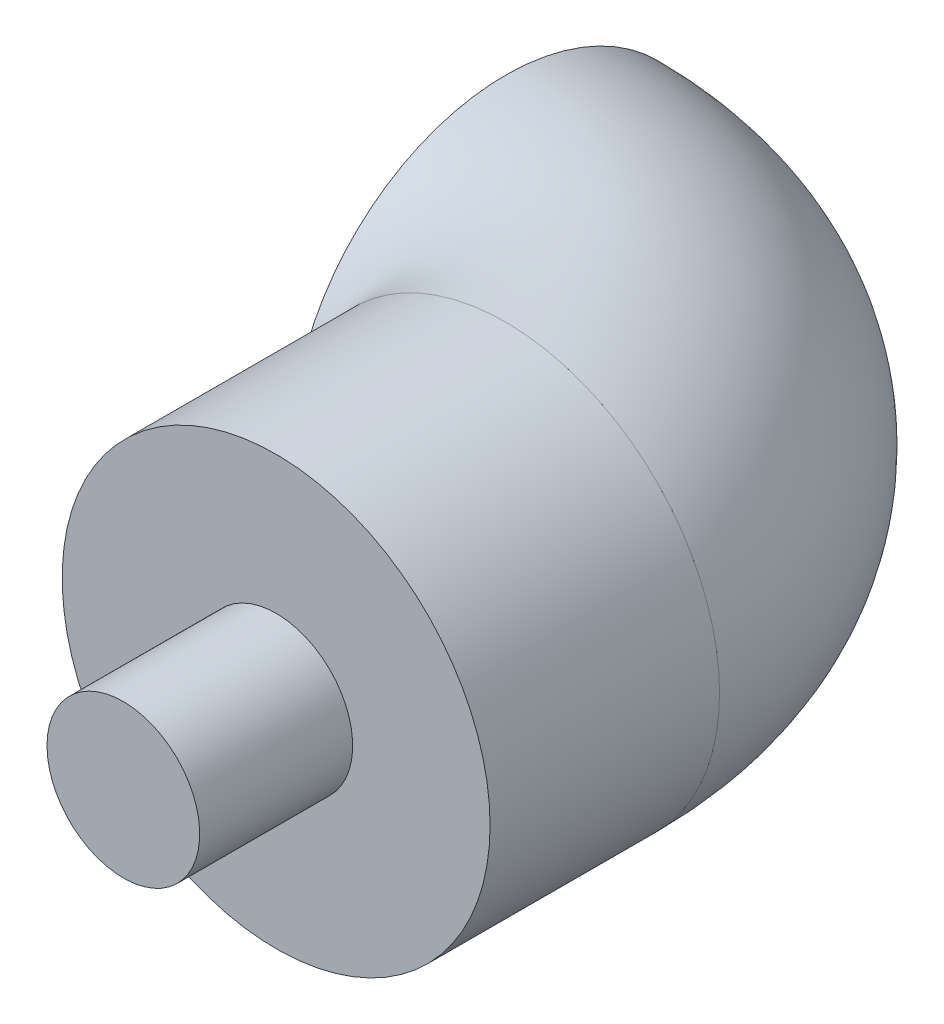
ISO-10303-21;
HEADER;
FILE_DESCRIPTION(('STEP AP214'),'2;1');
FILE_NAME('part.step','',(''),(''),'','','');
FILE_SCHEMA(('AUTOMOTIVE_DESIGN { 1 0 10303 214 1 1 1 1 }'));
ENDSEC;
DATA;
#1=APPLICATION_CONTEXT('core data for automotive mechanical design processes');
#2=APPLICATION_PROTOCOL_DEFINITION('international standard','automotive_design',2000,#1);
#3=PRODUCT_CONTEXT('',#1,'mechanical');
#4=PRODUCT('Part','Part','',(#3));
#5=PRODUCT_RELATED_PRODUCT_CATEGORY('part','',(#4));
#6=PRODUCT_DEFINITION_FORMATION('','',#4);
#7=PRODUCT_DEFINITION_CONTEXT('part definition',#1,'design');
#8=PRODUCT_DEFINITION('design','',#6,#7);
#9=PRODUCT_DEFINITION_SHAPE('','',#8);
#10=(LENGTH_UNIT() NAMED_UNIT(*) SI_UNIT(.MILLI.,.METRE.));
#11=(NAMED_UNIT(*) PLANE_ANGLE_UNIT() SI_UNIT($,.RADIAN.));
#12=(NAMED_UNIT(*) SI_UNIT($,.STERADIAN.) SOLID_ANGLE_UNIT());
#13=UNCERTAINTY_MEASURE_WITH_UNIT(LENGTH_MEASURE(1.E-05),#10,'distance_accuracy_value','');
#14=(GEOMETRIC_REPRESENTATION_CONTEXT(3) GLOBAL_UNCERTAINTY_ASSIGNED_CONTEXT((#13)) GLOBAL_UNIT_ASSIGNED_CONTEXT((#10,
#11,#12)) REPRESENTATION_CONTEXT('',''));
#15=CARTESIAN_POINT('',(0.,0.,0.));
#16=DIRECTION('',(0.,0.,1.));
#17=DIRECTION('',(1.,0.,0.));
#18=AXIS2_PLACEMENT_3D('',#15,#16,#17);
#19=CARTESIAN_POINT('',(0.,0.,0.));
#20=DIRECTION('',(1.,0.,0.));
#21=DIRECTION('',(0.,0.,-1.));
#22=AXIS2_PLACEMENT_3D('',#19,#20,#21);
#23=PLANE('',#22);
#24=CARTESIAN_POINT('',(0.,0.,0.));
#25=DIRECTION('',(-1.,0.,0.));
#26=DIRECTION('',(0.,0.,1.));
#27=AXIS2_PLACEMENT_3D('',#24,#25,#26);
#28=CIRCLE('',#27,25.);
#29=CARTESIAN_POINT('',(0.,0.,25.));
#30=VERTEX_POINT('',#29);
#31=EDGE_CURVE('E151',#30,#30,#28,.T.);
#32=ORIENTED_EDGE('',*,*,#31,.F.);
#33=EDGE_LOOP('',(#32));
#34=FACE_BOUND('',#33,.T.);
#35=CARTESIAN_POINT('',(0.,0.,75291.7747451518));
#36=DIRECTION('',(1.,0.,0.));
#37=DIRECTION('',(0.,0.,-1.));
#38=AXIS2_PLACEMENT_3D('',#35,#36,#37);
#39=ELLIPSE('',#38,75273.1913815593,70.0565010235184);
#40=CARTESIAN_POINT('',(0.,-2.58729203974121,69.9347905498961));
#41=VERTEX_POINT('',#40);
#42=CARTESIAN_POINT('',(0.,-2.58772923929178,69.9521526286655));
#43=VERTEX_POINT('',#42);
#44=EDGE_CURVE('E55',#41,#43,#39,.F.);
#45=ORIENTED_EDGE('',*,*,#44,.F.);
#46=DIRECTION('',(0.,-1.,0.));
#47=VECTOR('',#46,1.);
#48=CARTESIAN_POINT('',(0.,0.,69.9347905498961));
#49=LINE('',#48,#47);
#50=CARTESIAN_POINT('',(0.,2.58729203974121,69.9347905498961));
#51=VERTEX_POINT('',#50);
#52=EDGE_CURVE('E59',#51,#41,#49,.T.);
#53=ORIENTED_EDGE('',*,*,#52,.F.);
#54=CARTESIAN_POINT('',(0.,2.58772923929137,69.9521526286655));
#55=VERTEX_POINT('',#54);
#56=EDGE_CURVE('E154',#55,#51,#39,.F.);
#57=ORIENTED_EDGE('',*,*,#56,.F.);
#58=CARTESIAN_POINT('',(0.,0.,0.));
#59=DIRECTION('',(1.,0.,0.));
#60=DIRECTION('',(0.,0.,-1.));
#61=AXIS2_PLACEMENT_3D('',#58,#59,#60);
#62=CIRCLE('',#61,70.);
#63=EDGE_CURVE('E88',#43,#55,#62,.T.);
#64=ORIENTED_EDGE('',*,*,#63,.F.);
#65=EDGE_LOOP('',(#45,#53,#57,#64));
#66=FACE_BOUND('',#65,.T.);
#67=ADVANCED_FACE('F35',(#34,#66),#23,.F.);
#68=CARTESIAN_POINT('',(140.065148788121,0.,70.0651487598923));
#69=CARTESIAN_POINT('',(140.103340216377,0.,-12.0054841209013));
#70=CARTESIAN_POINT('',(82.0706328807858,0.,-70.0381914447962));
#71=CARTESIAN_POINT('',(0.,0.,-70.));
#72=CARTESIAN_POINT('',(140.065148788121,140.,70.0651487598923));
#73=CARTESIAN_POINT('',(140.103340216377,140.,-12.0054841209013));
#74=CARTESIAN_POINT('',(82.0706328807858,140.,-70.0381914447962));
#75=CARTESIAN_POINT('',(0.,140.,-70.));
#76=CARTESIAN_POINT('',(0.0652094218618407,140.,69.9348512401076));
#77=CARTESIAN_POINT('',(0.0270179936063658,140.,69.9348156954609));
#78=CARTESIAN_POINT('',(0.,140.,69.9618085552039));
#79=CARTESIAN_POINT('',(0.,140.,70.));
#80=CARTESIAN_POINT('',(0.0652094218618338,0.,69.9348512401076));
#81=CARTESIAN_POINT('',(0.0270179936063589,0.,69.934815695461));
#82=CARTESIAN_POINT('',(0.,0.,69.9618085552039));
#83=CARTESIAN_POINT('',(0.,0.,70.));
#84=CARTESIAN_POINT('',(0.0652094218618199,-140.,69.9348512401076));
#85=CARTESIAN_POINT('',(0.027017993606345,-140.,69.934815695461));
#86=CARTESIAN_POINT('',(0.,-140.,69.9618085552039));
#87=CARTESIAN_POINT('',(0.,-140.,70.));
#88=CARTESIAN_POINT('',(140.065148788121,-140.,70.0651487598923));
#89=CARTESIAN_POINT('',(140.103340216377,-140.,-12.0054841209013));
#90=CARTESIAN_POINT('',(82.0706328807858,-140.,-70.0381914447962));
#91=CARTESIAN_POINT('',(0.,-140.,-70.));
#92=CARTESIAN_POINT('',(140.065148788121,0.,70.0651487598923));
#93=CARTESIAN_POINT('',(140.103340216377,0.,-12.0054841209013));
#94=CARTESIAN_POINT('',(82.0706328807858,0.,-70.0381914447962));
#95=CARTESIAN_POINT('',(0.,0.,-70.));
#96=(BOUNDED_SURFACE() B_SPLINE_SURFACE(3,3,((#68,#69,#70,#71),(#72,#73,#74,#75),(#76,#77,#78,
#79),(#80,#81,#82,#83),(#84,#85,#86,#87),(#88,#89,#90,#91),(#92,#93,#94,#95)),.UNSPECIFIED.,.T.,
.F.,.F.) B_SPLINE_SURFACE_WITH_KNOTS((4,3,4),(4,4),(0.,0.5,1.),(0.,1.),
.UNSPECIFIED.) GEOMETRIC_REPRESENTATION_ITEM() RATIONAL_B_SPLINE_SURFACE(((1.,0.804518435774239,
0.804518435774239,1.),(0.333333333333333,0.268172811924746,0.268172811924746,0.333333333333333),
(0.333333333333333,0.268172811924746,0.268172811924746,0.333333333333333),(1.,0.804518435774239,
0.804518435774239,1.),(0.333333333333333,0.268172811924746,0.268172811924746,0.333333333333333),
(0.333333333333333,0.268172811924746,0.268172811924746,0.333333333333333),(1.,0.804518435774239,
0.804518435774239,1.))) REPRESENTATION_ITEM('') SURFACE());
#97=CARTESIAN_POINT('',(0.00868561100792703,-2.81249746716931,69.934798633568));
#98=CARTESIAN_POINT('',(0.00753190684822756,-2.78382990512204,69.9368118922766));
#99=CARTESIAN_POINT('',(0.00639587249838439,-2.7551635210853,69.9388623754148));
#100=CARTESIAN_POINT('',(0.00415939050928523,-2.69784332030574,69.9431304370902));
#101=CARTESIAN_POINT('',(0.00305894111823981,-2.66918950301298,69.945348007384));
#102=CARTESIAN_POINT('',(0.00060102815980609,-2.60415647042108,69.9506778469741));
#103=CARTESIAN_POINT('',(-0.000745470780819949,-2.5677833789847,69.953869902092));
#104=CARTESIAN_POINT('',(-0.00272244902146333,-2.51323316935009,69.958788739418));
#105=CARTESIAN_POINT('',(-0.0033743358777023,-2.49505068953346,69.9604502058469));
#106=CARTESIAN_POINT('',(-0.00466380894222587,-2.45869057699899,69.9638277748144));
#107=CARTESIAN_POINT('',(-0.0053013953633034,-2.44051294421301,69.9655438765392));
#108=CARTESIAN_POINT('',(-0.00593182815854606,-2.42233810018532,69.9672928623925));
#109=B_SPLINE_CURVE_WITH_KNOTS('',3,(#97,#98,#99,#100,#101,#102,#103,#104,#105,#106,#107,#108),
.UNSPECIFIED.,.F.,.F.,(4,2,2,2,2,4),(0.,0.0862851383287737,0.172566022494437,0.2821774175604,
0.336987022078527,0.391795810478566),.UNSPECIFIED.);
#110=CARTESIAN_POINT('',(0.0086856110072962,-2.81249746718449,69.934798633568));
#111=VERTEX_POINT('',#110);
#112=EDGE_CURVE('E38',#43,#111,#109,.F.);
#113=CARTESIAN_POINT('',(0.00868561100791812,2.81249746716913,69.934798633568));
#114=CARTESIAN_POINT('',(0.00753190684819536,2.78382990512185,69.9368118922766));
#115=CARTESIAN_POINT('',(0.00639587249835783,2.75516352108511,69.9388623754148));
#116=CARTESIAN_POINT('',(0.00415939050928406,2.69784332030555,69.9431304370902));
#117=CARTESIAN_POINT('',(0.00305894111825838,2.66918950301279,69.945348007384));
#118=CARTESIAN_POINT('',(0.000601028159836534,2.60415647042091,69.9506778469741));
#119=CARTESIAN_POINT('',(-0.000745470780806505,2.56778337898454,69.953869902092));
#120=CARTESIAN_POINT('',(-0.00272244902147012,2.51323316934996,69.958788739418));
#121=CARTESIAN_POINT('',(-0.00337433587771495,2.49505068953333,69.9604502058469));
#122=CARTESIAN_POINT('',(-0.00466380894224088,2.45869057699888,69.9638277748144));
#123=CARTESIAN_POINT('',(-0.0053013953633149,2.4405129442129,69.9655438765392));
#124=CARTESIAN_POINT('',(-0.00593182815854557,2.42233810018522,69.9672928623925));
#125=B_SPLINE_CURVE_WITH_KNOTS('',3,(#113,#114,#115,#116,#117,#118,#119,#120,#121,#122,#123,
#124),.UNSPECIFIED.,.F.,.F.,(4,2,2,2,2,4),(0.,0.0862851383287758,0.172566022494442,
0.282177417560356,0.336987022078459,0.391795810478474),.UNSPECIFIED.);
#126=CARTESIAN_POINT('',(0.00868561100852983,2.81249746718406,69.934798633568));
#127=VERTEX_POINT('',#126);
#128=EDGE_CURVE('E83',#127,#55,#125,.T.);
#129=CARTESIAN_POINT('',(0.,3.0207732027023,69.9347905498961));
#130=CARTESIAN_POINT('',(0.002653109678426,2.95935028210593,69.9347930191373));
#131=CARTESIAN_POINT('',(0.00522529942731622,2.89792383176034,69.9347954130665));
#132=CARTESIAN_POINT('',(0.0126990954782078,2.71363424884149,69.9348023689058));
#133=CARTESIAN_POINT('',(0.0173579139269765,2.59076120417925,69.9348067048541));
#134=CARTESIAN_POINT('',(0.0260279769837575,2.34499229457145,69.9348147740555));
#135=CARTESIAN_POINT('',(0.0300392215917698,2.2220964296259,69.9348185073087));
#136=CARTESIAN_POINT('',(0.037518434668484,1.97280532188933,69.9348254681897));
#137=CARTESIAN_POINT('',(0.0409678045907706,1.84640952334941,69.9348286785079));
#138=CARTESIAN_POINT('',(0.0489626289677222,1.52113770102521,69.9348361192667));
#139=CARTESIAN_POINT('',(0.0530028598003747,1.32224896330141,69.9348398794972));
#140=CARTESIAN_POINT('',(0.0582138556391189,0.9975739899518,69.9348447293553));
#141=CARTESIAN_POINT('',(0.0598934745389357,0.871795631736133,69.9348462925716));
#142=CARTESIAN_POINT('',(0.0621187740934234,0.663002916125671,69.9348483636511));
#143=CARTESIAN_POINT('',(0.0628558294546174,0.579990596274616,69.9348490496263));
#144=CARTESIAN_POINT('',(0.0637399026613999,0.455470645090134,69.9348498724305));
#145=CARTESIAN_POINT('',(0.0639976753372604,0.413963774088961,69.9348501123388));
#146=CARTESIAN_POINT('',(0.0644393838499403,0.330949632045231,69.9348505234356));
#147=CARTESIAN_POINT('',(0.0646233196867597,0.289442361002676,69.9348506946241));
#148=CARTESIAN_POINT('',(0.0648438452824738,0.227181272935434,69.9348508998666));
#149=CARTESIAN_POINT('',(0.0649081241156985,0.206427549740974,69.9348509596908));
#150=CARTESIAN_POINT('',(0.0650182223552002,0.164920053312017,69.9348510621589));
#151=CARTESIAN_POINT('',(0.0650640417614772,0.144166280077519,69.9348511048028));
#152=CARTESIAN_POINT('',(0.0651189263641668,0.113035597695108,69.9348511558838));
#153=CARTESIAN_POINT('',(0.0651349138136062,0.102658700197342,69.9348511707632));
#154=CARTESIAN_POINT('',(0.0651622737055982,0.081904898979041,69.934851196227));
#155=CARTESIAN_POINT('',(0.0651736461481508,0.0715279952585068,69.9348512068113));
#156=CARTESIAN_POINT('',(0.0651872440620694,0.0559626368900232,69.9348512194668));
#157=CARTESIAN_POINT('',(0.06519119990837,0.0507741836840181,69.9348512231485));
#158=CARTESIAN_POINT('',(0.0651979571582417,0.040397276503101,69.9348512294374));
#159=CARTESIAN_POINT('',(0.0652007585618129,0.035208822528189,69.9348512320447));
#160=CARTESIAN_POINT('',(0.0652040973395299,0.0274261412244881,69.9348512351521));
#161=CARTESIAN_POINT('',(0.0652050663774943,0.0248319140723762,69.934851236054));
#162=CARTESIAN_POINT('',(0.065206712141491,0.0196434596737542,69.9348512375857));
#163=CARTESIAN_POINT('',(0.0652073888675232,0.017049232427244,69.9348512382156));
#164=CARTESIAN_POINT('',(0.0652081960178219,0.0131578915174152,69.9348512389668));
#165=CARTESIAN_POINT('',(0.0652084304114631,0.0118607778748867,69.9348512391849));
#166=CARTESIAN_POINT('',(0.0652088111966358,0.00926655057660915,69.9348512395394));
#167=CARTESIAN_POINT('',(0.0652089575881674,0.00796943692086013,69.9348512396757));
#168=CARTESIAN_POINT('',(0.0652090506340473,0.00667232325933534,69.9348512397627));
#169=B_SPLINE_CURVE_WITH_KNOTS('',3,(#129,#130,#131,#132,#133,#134,#135,#136,#137,#138,#139,
#140,#141,#142,#143,#144,#145,#146,#147,#148,#149,#150,#151,#152,#153,#154,#155,#156,#157,#158,
#159,#160,#161,#162,#163,#164,#165,#166,#167,#168),.UNSPECIFIED.,.F.,.F.,(4,2,2,2,2,2,2,2,2,2,2,
2,2,2,2,2,2,2,2,4),(0.,0.184440617478999,0.553322812810888,0.922205008142773,1.30153196416904,
1.898313066181,2.27568014461267,2.52472636185557,2.64924932270712,2.77377228355865,
2.83603374551329,2.89829520746792,2.92942593613635,2.96055666480477,2.97612202885037,
2.99168739289597,2.99947007488271,3.00725275686954,3.0111440978584,3.01503543884881),.UNSPECIFIED.);
#170=CARTESIAN_POINT('',(0.0652097398609469,0.00667232319363896,69.9348512404036));
#171=VERTEX_POINT('',#170);
#172=EDGE_CURVE('E86',#171,#127,#169,.F.);
#173=CARTESIAN_POINT('',(70.0651791049916,0.,70.));
#174=DIRECTION('',(-0.000930696569890367,0.,0.999999566901854));
#175=DIRECTION('',(0.999999566901854,0.,0.000930696569890367));
#176=AXIS2_PLACEMENT_3D('',#173,#174,#175);
#177=CIRCLE('',#176,70.);
#178=CARTESIAN_POINT('',(140.065148788121,5.31460538957503E-12,70.0651487598923));
#179=VERTEX_POINT('',#178);
#180=EDGE_CURVE('E97',#179,#171,#177,.T.);
#181=CARTESIAN_POINT('',(0.0652097398609469,-0.00667232318882451,69.9348512404036));
#182=VERTEX_POINT('',#181);
#183=EDGE_CURVE('E157',#182,#179,#177,.T.);
#184=CARTESIAN_POINT('',(0.,-3.0207732027023,69.9347905498961));
#185=CARTESIAN_POINT('',(0.00265310967843998,-2.95935028210593,69.9347930191373));
#186=CARTESIAN_POINT('',(0.0052252994273312,-2.89792383176036,69.9347954130665));
#187=CARTESIAN_POINT('',(0.0126990954782096,-2.71363424884153,69.9348023689058));
#188=CARTESIAN_POINT('',(0.0173579139269473,-2.5907612041793,69.9348067048541));
#189=CARTESIAN_POINT('',(0.0260279769837393,-2.34499229457153,69.9348147740555));
#190=CARTESIAN_POINT('',(0.0300392215917937,-2.22209642962599,69.9348185073087));
#191=CARTESIAN_POINT('',(0.0375184346685364,-1.97280532188953,69.9348254681897));
#192=CARTESIAN_POINT('',(0.0409678045908086,-1.84640952334973,69.9348286785078));
#193=CARTESIAN_POINT('',(0.0489626289677443,-1.52113770102574,69.9348361192667));
#194=CARTESIAN_POINT('',(0.0530028598004057,-1.32224896330205,69.9348398794973));
#195=CARTESIAN_POINT('',(0.0582138556391943,-0.997573989952707,69.9348447293553));
#196=CARTESIAN_POINT('',(0.0598934745390355,-0.871795631737204,69.9348462925716));
#197=CARTESIAN_POINT('',(0.062118774093342,-0.66300291612633,69.9348483636511));
#198=CARTESIAN_POINT('',(0.0628558294544057,-0.579990596274697,69.9348490496263));
#199=CARTESIAN_POINT('',(0.0637399026619135,-0.455470645089347,69.9348498724305));
#200=CARTESIAN_POINT('',(0.0639976753381692,-0.413963774087886,69.9348501123388));
#201=CARTESIAN_POINT('',(0.0644393838473969,-0.330949632043571,69.9348505234356));
#202=CARTESIAN_POINT('',(0.0646233196803689,-0.289442361000716,69.9348506946241));
#203=CARTESIAN_POINT('',(0.0648438452854364,-0.227181272933045,69.9348508998666));
#204=CARTESIAN_POINT('',(0.0649081241242996,-0.206427549738446,69.9348509596907));
#205=CARTESIAN_POINT('',(0.0650182223586552,-0.164920053309216,69.9348510621588));
#206=CARTESIAN_POINT('',(0.0650640417541477,-0.144166280074586,69.9348511048028));
#207=CARTESIAN_POINT('',(0.0651189263928502,-0.113035597691973,69.9348511558838));
#208=CARTESIAN_POINT('',(0.0651349138629922,-0.102658700194141,69.9348511707633));
#209=CARTESIAN_POINT('',(0.0651622736562,-0.0819048989756302,69.934851196227));
#210=CARTESIAN_POINT('',(0.0651736459792658,-0.0715279952549524,69.9348512068112));
#211=CARTESIAN_POINT('',(0.0651872440651287,-0.0559626368864146,69.9348512194669));
#212=CARTESIAN_POINT('',(0.0651912000272731,-0.0507741836804218,69.9348512231486));
#213=CARTESIAN_POINT('',(0.0651979570227463,-0.0403972764993722,69.9348512294373));
#214=CARTESIAN_POINT('',(0.0652007580560752,-0.0352088225243152,69.9348512320443));
#215=CARTESIAN_POINT('',(0.0652040973885611,-0.0274261412206485,69.9348512351522));
#216=CARTESIAN_POINT('',(0.0652050667964707,-0.0248319140685952,69.9348512360544));
#217=CARTESIAN_POINT('',(0.0652067114725824,-0.0196434596697474,69.9348512375851));
#218=CARTESIAN_POINT('',(0.0652073867407846,-0.0170492324229528,69.9348512382137));
#219=CARTESIAN_POINT('',(0.0652081962986111,-0.0131578915135007,69.934851238967));
#220=CARTESIAN_POINT('',(0.0652084322604737,-0.0118607778712459,69.9348512391866));
#221=CARTESIAN_POINT('',(0.0652088134617819,-0.00926655057303389,69.9348512395414));
#222=CARTESIAN_POINT('',(0.0652089587012274,-0.00796943691707669,69.9348512396767));
#223=CARTESIAN_POINT('',(0.0652090471090017,-0.00667232325485689,69.9348512397592));
#224=B_SPLINE_CURVE_WITH_KNOTS('',3,(#184,#185,#186,#187,#188,#189,#190,#191,#192,#193,#194,
#195,#196,#197,#198,#199,#200,#201,#202,#203,#204,#205,#206,#207,#208,#209,#210,#211,#212,#213,
#214,#215,#216,#217,#218,#219,#220,#221,#222,#223),.UNSPECIFIED.,.F.,.F.,(4,2,2,2,2,2,2,2,2,2,2,
2,2,2,2,2,2,2,2,4),(0.,0.184440617478959,0.553322812810815,0.92220500814267,1.30153196416861,
1.89831306618025,2.27568014461142,2.52472636185606,2.64924932270846,2.77377228356089,
2.83603374551596,2.89829520747102,2.92942593613965,2.96055666480832,2.97612202885401,
2.99168739289974,2.99947007488651,3.00725275687341,3.01114409786222,3.01503543885295),.UNSPECIFIED.);
#225=EDGE_CURVE('E91',#111,#182,#224,.T.);
#226=ORIENTED_EDGE('',*,*,#112,.F.);
#227=ORIENTED_EDGE('',*,*,#63,.T.);
#228=ORIENTED_EDGE('',*,*,#128,.F.);
#229=ORIENTED_EDGE('',*,*,#172,.F.);
#230=ORIENTED_EDGE('',*,*,#180,.F.);
#231=ORIENTED_EDGE('',*,*,#183,.F.);
#232=ORIENTED_EDGE('',*,*,#225,.F.);
#233=EDGE_LOOP('',(#226,#227,#228,#229,#230,#231,#232));
#234=FACE_BOUND('',#233,.T.);
#235=ADVANCED_FACE('F85',(#234),#96,.F.);
#236=CARTESIAN_POINT('',(50.,0.,0.));
#237=DIRECTION('',(-1.,0.,0.));
#238=DIRECTION('',(0.,0.,1.));
#239=AXIS2_PLACEMENT_3D('',#236,#237,#238);
#240=CYLINDRICAL_SURFACE('',#239,25.);
#241=CARTESIAN_POINT('',(50.,0.,0.));
#242=DIRECTION('',(-1.,0.,0.));
#243=DIRECTION('',(0.,0.,1.));
#244=AXIS2_PLACEMENT_3D('',#241,#242,#243);
#245=CIRCLE('',#244,25.);
#246=CARTESIAN_POINT('',(50.,0.,25.));
#247=VERTEX_POINT('',#246);
#248=EDGE_CURVE('E153',#247,#247,#245,.T.);
#249=ORIENTED_EDGE('',*,*,#248,.F.);
#250=EDGE_LOOP('',(#249));
#251=FACE_BOUND('',#250,.T.);
#252=ORIENTED_EDGE('',*,*,#31,.T.);
#253=EDGE_LOOP('',(#252));
#254=FACE_BOUND('',#253,.T.);
#255=ADVANCED_FACE('F140',(#251,#254),#240,.F.);
#256=CARTESIAN_POINT('',(50.,0.,0.));
#257=DIRECTION('',(-1.,0.,0.));
#258=DIRECTION('',(0.,0.,1.));
#259=AXIS2_PLACEMENT_3D('',#256,#257,#258);
#260=PLANE('',#259);
#261=ORIENTED_EDGE('',*,*,#248,.T.);
#262=EDGE_LOOP('',(#261));
#263=FACE_BOUND('',#262,.T.);
#264=ADVANCED_FACE('F132',(#263),#260,.T.);
#265=CARTESIAN_POINT('',(69.9388758632066,0.,144.99991493233));
#266=DIRECTION('',(0.000930696569890367,0.,-0.999999566901854));
#267=DIRECTION('',(-0.999999566901854,0.,-0.000930696569890367));
#268=AXIS2_PLACEMENT_3D('',#265,#266,#267);
#269=CYLINDRICAL_SURFACE('',#268,70.0565010235184);
#270=CARTESIAN_POINT('',(69.9388758632066,0.,144.99991493233));
#271=DIRECTION('',(-0.000930696569890367,0.,0.999999566901854));
#272=DIRECTION('',(0.999999566901854,0.,0.000930696569890367));
#273=AXIS2_PLACEMENT_3D('',#270,#271,#272);
#274=CIRCLE('',#273,70.0565010235184);
#275=CARTESIAN_POINT('',(139.995346545384,0.,145.065116277531));
#276=VERTEX_POINT('',#275);
#277=EDGE_CURVE('E104',#276,#276,#274,.T.);
#278=ORIENTED_EDGE('',*,*,#277,.F.);
#279=EDGE_LOOP('',(#278));
#280=FACE_BOUND('',#279,.T.);
#281=ORIENTED_EDGE('',*,*,#128,.T.);
#282=ORIENTED_EDGE('',*,*,#56,.T.);
#283=CARTESIAN_POINT('',(70.0086781059483,0.,69.9999474146912));
#284=DIRECTION('',(-0.000930696569890367,0.,0.999999566901854));
#285=DIRECTION('',(0.999999566901854,0.,0.000930696569890367));
#286=AXIS2_PLACEMENT_3D('',#283,#284,#285);
#287=CIRCLE('',#286,70.0565010235184);
#288=EDGE_CURVE('E105',#51,#41,#287,.T.);
#289=ORIENTED_EDGE('',*,*,#288,.T.);
#290=ORIENTED_EDGE('',*,*,#44,.T.);
#291=ORIENTED_EDGE('',*,*,#112,.T.);
#292=EDGE_CURVE('E103',#111,#179,#287,.T.);
#293=ORIENTED_EDGE('',*,*,#292,.T.);
#294=EDGE_CURVE('E96',#179,#127,#287,.T.);
#295=ORIENTED_EDGE('',*,*,#294,.T.);
#296=EDGE_LOOP('',(#281,#282,#289,#290,#291,#293,#295));
#297=FACE_BOUND('',#296,.T.);
#298=ADVANCED_FACE('F100',(#280,#297),#269,.T.);
#299=CARTESIAN_POINT('',(70.0086781059483,0.,69.9999474146912));
#300=DIRECTION('',(-0.000930696569890367,0.,0.999999566901854));
#301=DIRECTION('',(0.999999566901854,0.,0.000930696569890367));
#302=AXIS2_PLACEMENT_3D('',#299,#300,#301);
#303=PLANE('',#302);
#304=ORIENTED_EDGE('',*,*,#288,.F.);
#305=ORIENTED_EDGE('',*,*,#52,.T.);
#306=EDGE_LOOP('',(#304,#305));
#307=FACE_BOUND('',#306,.T.);
#308=ADVANCED_FACE('F131',(#307),#303,.F.);
#309=ORIENTED_EDGE('',*,*,#292,.F.);
#310=ORIENTED_EDGE('',*,*,#225,.T.);
#311=ORIENTED_EDGE('',*,*,#183,.T.);
#312=EDGE_LOOP('',(#309,#310,#311));
#313=FACE_BOUND('',#312,.T.);
#314=ADVANCED_FACE('F137',(#313),#303,.F.);
#315=ORIENTED_EDGE('',*,*,#294,.F.);
#316=ORIENTED_EDGE('',*,*,#180,.T.);
#317=ORIENTED_EDGE('',*,*,#172,.T.);
#318=EDGE_LOOP('',(#315,#316,#317));
#319=FACE_BOUND('',#318,.T.);
#320=ADVANCED_FACE('F95',(#319),#303,.F.);
#321=CARTESIAN_POINT('',(69.9388758632066,0.,144.99991493233));
#322=DIRECTION('',(-0.000930696569890367,0.,0.999999566901854));
#323=DIRECTION('',(0.999999566901854,0.,0.000930696569890367));
#324=AXIS2_PLACEMENT_3D('',#321,#322,#323);
#325=PLANE('',#324);
#326=CARTESIAN_POINT('',(69.9953768622498,0.,144.999967517639));
#327=DIRECTION('',(-0.000930696569890367,0.,0.999999566901854));
#328=DIRECTION('',(0.999999566901854,0.,0.000930696569890367));
#329=AXIS2_PLACEMENT_3D('',#326,#327,#328);
#330=CIRCLE('',#329,25.);
#331=CARTESIAN_POINT('',(44.9953876897035,0.,144.976700103392));
#332=VERTEX_POINT('',#331);
#333=EDGE_CURVE('E11',#332,#332,#330,.T.);
#334=ORIENTED_EDGE('',*,*,#333,.F.);
#335=EDGE_LOOP('',(#334));
#336=FACE_BOUND('',#335,.T.);
#337=ORIENTED_EDGE('',*,*,#277,.T.);
#338=EDGE_LOOP('',(#337));
#339=FACE_BOUND('',#338,.T.);
#340=ADVANCED_FACE('F121',(#336,#339),#325,.T.);
#341=CARTESIAN_POINT('',(69.9488420337553,0.,194.999945862732));
#342=DIRECTION('',(0.000930696569890367,0.,-0.999999566901854));
#343=DIRECTION('',(-0.999999566901854,0.,-0.000930696569890367));
#344=AXIS2_PLACEMENT_3D('',#341,#342,#343);
#345=CYLINDRICAL_SURFACE('',#344,25.);
#346=CARTESIAN_POINT('',(69.9488420337553,0.,194.999945862732));
#347=DIRECTION('',(-0.000930696569890367,0.,0.999999566901854));
#348=DIRECTION('',(0.999999566901854,0.,0.000930696569890367));
#349=AXIS2_PLACEMENT_3D('',#346,#347,#348);
#350=CIRCLE('',#349,25.);
#351=CARTESIAN_POINT('',(44.948852861209,0.,194.976678448485));
#352=VERTEX_POINT('',#351);
#353=EDGE_CURVE('E111',#352,#352,#350,.T.);
#354=CARTESIAN_POINT('',(44.948852861209,0.,194.976678448485));
#355=CARTESIAN_POINT('',(44.9493375990058,0.,194.455845340723));
#356=CARTESIAN_POINT('',(44.9498223368026,0.,193.935012232962));
#357=CARTESIAN_POINT('',(44.9507918123963,0.,192.893346017439));
#358=CARTESIAN_POINT('',(44.9512765501931,0.,192.372512909678));
#359=CARTESIAN_POINT('',(44.9522460257867,0.,191.330846694155));
#360=CARTESIAN_POINT('',(44.9527307635835,0.,190.810013586393));
#361=CARTESIAN_POINT('',(44.9537002391772,0.,189.768347370871));
#362=CARTESIAN_POINT('',(44.954184976974,0.,189.247514263109));
#363=CARTESIAN_POINT('',(44.9551544525676,0.,188.205848047587));
#364=CARTESIAN_POINT('',(44.9556391903644,0.,187.685014939825));
#365=CARTESIAN_POINT('',(44.9566086659581,0.,186.643348724302));
#366=CARTESIAN_POINT('',(44.9570934037549,0.,186.122515616541));
#367=CARTESIAN_POINT('',(44.9580628793485,0.,185.080849401018));
#368=CARTESIAN_POINT('',(44.9585476171453,0.,184.560016293257));
#369=CARTESIAN_POINT('',(44.959517092739,0.,183.518350077734));
#370=CARTESIAN_POINT('',(44.9600018305358,0.,182.997516969973));
#371=CARTESIAN_POINT('',(44.9609713061294,0.,181.95585075445));
#372=CARTESIAN_POINT('',(44.9614560439262,0.,181.435017646689));
#373=CARTESIAN_POINT('',(44.9624255195199,0.,180.393351431166));
#374=CARTESIAN_POINT('',(44.9629102573167,0.,179.872518323404));
#375=CARTESIAN_POINT('',(44.9638797329103,0.,178.830852107882));
#376=CARTESIAN_POINT('',(44.9643644707071,0.,178.31001900012));
#377=CARTESIAN_POINT('',(44.9653339463008,0.,177.268352784598));
#378=CARTESIAN_POINT('',(44.9658186840976,0.,176.747519676836));
#379=CARTESIAN_POINT('',(44.9667881596912,0.,175.705853461313));
#380=CARTESIAN_POINT('',(44.9672728974881,0.,175.185020353552));
#381=CARTESIAN_POINT('',(44.9682423730817,0.,174.143354138029));
#382=CARTESIAN_POINT('',(44.9687271108785,0.,173.622521030268));
#383=CARTESIAN_POINT('',(44.9696965864721,0.,172.580854814745));
#384=CARTESIAN_POINT('',(44.970181324269,0.,172.060021706984));
#385=CARTESIAN_POINT('',(44.9711507998626,0.,171.018355491461));
#386=CARTESIAN_POINT('',(44.9716355376594,0.,170.4975223837));
#387=CARTESIAN_POINT('',(44.9726050132531,0.,169.455856168177));
#388=CARTESIAN_POINT('',(44.9730897510499,0.,168.935023060415));
#389=CARTESIAN_POINT('',(44.9740592266435,0.,167.893356844893));
#390=CARTESIAN_POINT('',(44.9745439644403,0.,167.372523737131));
#391=CARTESIAN_POINT('',(44.975513440034,0.,166.330857521608));
#392=CARTESIAN_POINT('',(44.9759981778308,0.,165.810024413847));
#393=CARTESIAN_POINT('',(44.9769676534244,0.,164.768358198324));
#394=CARTESIAN_POINT('',(44.9774523912212,0.,164.247525090563));
#395=CARTESIAN_POINT('',(44.9784218668149,0.,163.20585887504));
#396=CARTESIAN_POINT('',(44.9789066046117,0.,162.685025767279));
#397=CARTESIAN_POINT('',(44.9798760802053,0.,161.643359551756));
#398=CARTESIAN_POINT('',(44.9803608180021,0.,161.122526443995));
#399=CARTESIAN_POINT('',(44.9813302935958,0.,160.080860228472));
#400=CARTESIAN_POINT('',(44.9818150313926,0.,159.560027120711));
#401=CARTESIAN_POINT('',(44.9827845069862,0.,158.518360905188));
#402=CARTESIAN_POINT('',(44.983269244783,0.,157.997527797426));
#403=CARTESIAN_POINT('',(44.9842387203767,0.,156.955861581904));
#404=CARTESIAN_POINT('',(44.9847234581735,0.,156.435028474142));
#405=CARTESIAN_POINT('',(44.9856929337671,0.,155.393362258619));
#406=CARTESIAN_POINT('',(44.986177671564,0.,154.872529150858));
#407=CARTESIAN_POINT('',(44.9871471471576,0.,153.830862935335));
#408=CARTESIAN_POINT('',(44.9876318849544,0.,153.310029827574));
#409=CARTESIAN_POINT('',(44.988601360548,0.,152.268363612051));
#410=CARTESIAN_POINT('',(44.9890860983449,0.,151.74753050429));
#411=CARTESIAN_POINT('',(44.9900555739385,0.,150.705864288767));
#412=CARTESIAN_POINT('',(44.9905403117353,0.,150.185031181006));
#413=CARTESIAN_POINT('',(44.991509787329,0.,149.143364965483));
#414=CARTESIAN_POINT('',(44.9919945251258,0.,148.622531857721));
#415=CARTESIAN_POINT('',(44.9929640007194,0.,147.580865642199));
#416=CARTESIAN_POINT('',(44.9934487385162,0.,147.060032534437));
#417=CARTESIAN_POINT('',(44.9944182141099,0.,146.018366318915));
#418=CARTESIAN_POINT('',(44.9949029519067,0.,145.497533211153));
#419=CARTESIAN_POINT('',(44.9953876897035,0.,144.976700103392));
#420=B_SPLINE_CURVE_WITH_KNOTS('',3,(#354,#355,#356,#357,#358,#359,#360,#361,#362,#363,#364,
#365,#366,#367,#368,#369,#370,#371,#372,#373,#374,#375,#376,#377,#378,#379,#380,#381,#382,#383,
#384,#385,#386,#387,#388,#389,#390,#391,#392,#393,#394,#395,#396,#397,#398,#399,#400,#401,#402,
#403,#404,#405,#406,#407,#408,#409,#410,#411,#412,#413,#414,#415,#416,#417,#418,#419),
.UNSPECIFIED.,.F.,.F.,(4,2,2,2,2,2,2,2,2,2,2,2,2,2,2,2,2,2,2,2,2,2,2,2,2,2,2,2,2,2,2,2,4),(0.,
1.56250000000003,3.12500000000002,4.68750000000002,6.25000000000002,7.81250000000002,
9.37500000000002,10.9375,12.5,14.0625,15.625,17.1875,18.75,20.3125,21.875,23.4375,25.,26.5625,
28.125,29.6875,31.25,32.8125,34.375,35.9375,37.5,39.0625,40.625,42.1875,43.7500000000001,
45.3125,46.8750000000001,48.4375,50.0000000000001),.UNSPECIFIED.);
#421=EDGE_CURVE('BSEAM118',#352,#332,#420,.T.);
#422=ORIENTED_EDGE('',*,*,#353,.F.);
#423=ORIENTED_EDGE('',*,*,#333,.T.);
#424=ORIENTED_EDGE('',*,*,#421,.T.);
#425=ORIENTED_EDGE('',*,*,#421,.F.);
#426=EDGE_LOOP('',(#422,#424,#423,#425));
#427=FACE_BOUND('',#426,.T.);
#428=ADVANCED_FACE('F118',(#427),#345,.T.);
#429=CARTESIAN_POINT('',(69.9488420337553,0.,194.999945862732));
#430=DIRECTION('',(-0.000930696569890367,0.,0.999999566901854));
#431=DIRECTION('',(0.999999566901854,0.,0.000930696569890367));
#432=AXIS2_PLACEMENT_3D('',#429,#430,#431);
#433=PLANE('',#432);
#434=ORIENTED_EDGE('',*,*,#353,.T.);
#435=EDGE_LOOP('',(#434));
#436=FACE_BOUND('',#435,.T.);
#437=ADVANCED_FACE('F116',(#436),#433,.T.);
#438=CLOSED_SHELL('',(#67,#235,#255,#264,#298,#308,#314,#320,#340,#428,#437));
#439=MANIFOLD_SOLID_BREP('B2',#438);
#440=ADVANCED_BREP_SHAPE_REPRESENTATION('',(#18,#439),#14);
#441=SHAPE_DEFINITION_REPRESENTATION(#9,#440);
ENDSEC;
END-ISO-10303-21;
